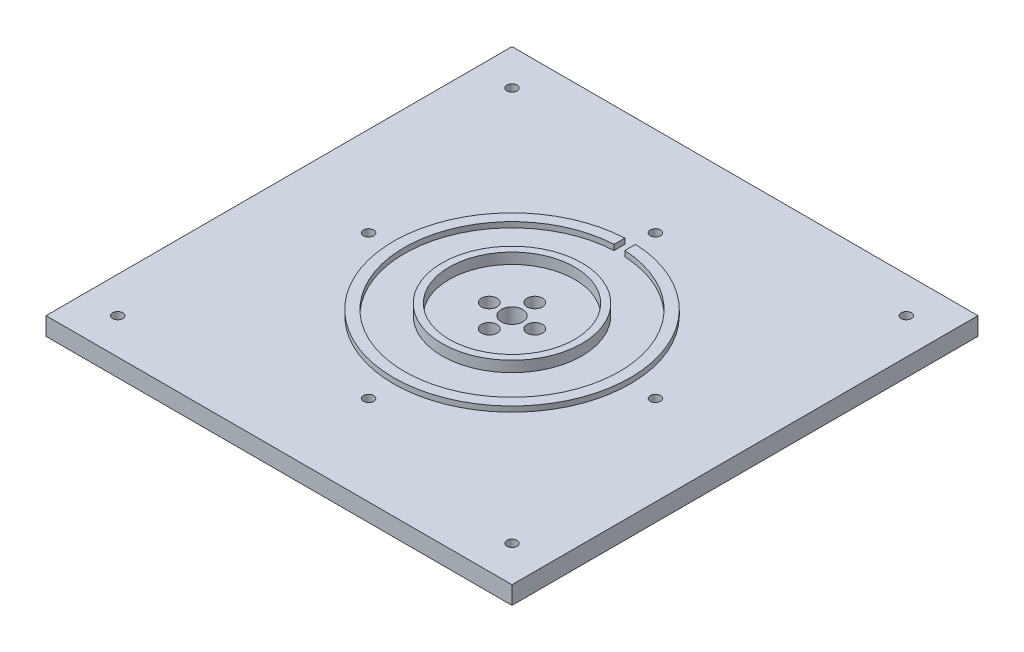
ISO-10303-21;
HEADER;
FILE_DESCRIPTION(('STEP AP214'),'2;1');
FILE_NAME('part.step','',(''),(''),'','','');
FILE_SCHEMA(('AUTOMOTIVE_DESIGN { 1 0 10303 214 1 1 1 1 }'));
ENDSEC;
DATA;
#1=APPLICATION_CONTEXT('core data for automotive mechanical design processes');
#2=APPLICATION_PROTOCOL_DEFINITION('international standard','automotive_design',2000,#1);
#3=PRODUCT_CONTEXT('',#1,'mechanical');
#4=PRODUCT('Part','Part','',(#3));
#5=PRODUCT_RELATED_PRODUCT_CATEGORY('part','',(#4));
#6=PRODUCT_DEFINITION_FORMATION('','',#4);
#7=PRODUCT_DEFINITION_CONTEXT('part definition',#1,'design');
#8=PRODUCT_DEFINITION('design','',#6,#7);
#9=PRODUCT_DEFINITION_SHAPE('','',#8);
#10=(LENGTH_UNIT() NAMED_UNIT(*) SI_UNIT(.MILLI.,.METRE.));
#11=(NAMED_UNIT(*) PLANE_ANGLE_UNIT() SI_UNIT($,.RADIAN.));
#12=(NAMED_UNIT(*) SI_UNIT($,.STERADIAN.) SOLID_ANGLE_UNIT());
#13=UNCERTAINTY_MEASURE_WITH_UNIT(LENGTH_MEASURE(1.E-05),#10,'distance_accuracy_value','');
#14=(GEOMETRIC_REPRESENTATION_CONTEXT(3) GLOBAL_UNCERTAINTY_ASSIGNED_CONTEXT((#13)) GLOBAL_UNIT_ASSIGNED_CONTEXT((#10,
#11,#12)) REPRESENTATION_CONTEXT('',''));
#15=CARTESIAN_POINT('',(0.,0.,0.));
#16=DIRECTION('',(0.,0.,1.));
#17=DIRECTION('',(1.,0.,0.));
#18=AXIS2_PLACEMENT_3D('',#15,#16,#17);
#19=CARTESIAN_POINT('',(0.,5.,0.));
#20=DIRECTION('',(0.,1.,0.));
#21=DIRECTION('',(0.,0.,1.));
#22=AXIS2_PLACEMENT_3D('',#19,#20,#21);
#23=PLANE('',#22);
#24=CARTESIAN_POINT('',(0.,5.,-6.35));
#25=DIRECTION('',(0.,1.,0.));
#26=DIRECTION('',(0.,0.,1.));
#27=AXIS2_PLACEMENT_3D('',#24,#25,#26);
#28=CIRCLE('',#27,2.15);
#29=CARTESIAN_POINT('',(0.,5.,-4.2));
#30=VERTEX_POINT('',#29);
#31=EDGE_CURVE('E216',#30,#30,#28,.T.);
#32=ORIENTED_EDGE('',*,*,#31,.F.);
#33=EDGE_LOOP('',(#32));
#34=FACE_BOUND('',#33,.T.);
#35=CARTESIAN_POINT('',(6.35000000000018,5.,-1.79700204165607E-13));
#36=DIRECTION('',(0.,1.,0.));
#37=DIRECTION('',(0.,0.,1.));
#38=AXIS2_PLACEMENT_3D('',#35,#36,#37);
#39=CIRCLE('',#38,2.15);
#40=CARTESIAN_POINT('',(6.35000000000018,5.,2.14999999999982));
#41=VERTEX_POINT('',#40);
#42=EDGE_CURVE('E217',#41,#41,#39,.T.);
#43=ORIENTED_EDGE('',*,*,#42,.F.);
#44=EDGE_LOOP('',(#43));
#45=FACE_BOUND('',#44,.T.);
#46=CARTESIAN_POINT('',(3.59400408331214E-13,5.,6.35));
#47=DIRECTION('',(0.,1.,0.));
#48=DIRECTION('',(0.,0.,1.));
#49=AXIS2_PLACEMENT_3D('',#46,#47,#48);
#50=CIRCLE('',#49,2.15);
#51=CARTESIAN_POINT('',(3.59400408331214E-13,5.,8.5));
#52=VERTEX_POINT('',#51);
#53=EDGE_CURVE('E204',#52,#52,#50,.T.);
#54=ORIENTED_EDGE('',*,*,#53,.F.);
#55=EDGE_LOOP('',(#54));
#56=FACE_BOUND('',#55,.T.);
#57=CARTESIAN_POINT('',(-6.34999999999982,5.,1.80477854883065E-13));
#58=DIRECTION('',(0.,1.,0.));
#59=DIRECTION('',(0.,0.,1.));
#60=AXIS2_PLACEMENT_3D('',#57,#58,#59);
#61=CIRCLE('',#60,2.15);
#62=CARTESIAN_POINT('',(-6.34999999999982,5.,2.15000000000018));
#63=VERTEX_POINT('',#62);
#64=EDGE_CURVE('E205',#63,#63,#61,.T.);
#65=ORIENTED_EDGE('',*,*,#64,.F.);
#66=EDGE_LOOP('',(#65));
#67=FACE_BOUND('',#66,.T.);
#68=CARTESIAN_POINT('',(0.,5.,0.));
#69=DIRECTION('',(0.,1.,0.));
#70=DIRECTION('',(0.,0.,1.));
#71=AXIS2_PLACEMENT_3D('',#68,#69,#70);
#72=CIRCLE('',#71,3.);
#73=CARTESIAN_POINT('',(0.,5.,3.));
#74=VERTEX_POINT('',#73);
#75=EDGE_CURVE('E169',#74,#74,#72,.T.);
#76=ORIENTED_EDGE('',*,*,#75,.F.);
#77=EDGE_LOOP('',(#76));
#78=FACE_BOUND('',#77,.T.);
#79=CARTESIAN_POINT('',(0.,5.,0.));
#80=DIRECTION('',(0.,1.,0.));
#81=DIRECTION('',(0.,0.,1.));
#82=AXIS2_PLACEMENT_3D('',#79,#80,#81);
#83=CIRCLE('',#82,17.5);
#84=CARTESIAN_POINT('',(0.,5.,17.5));
#85=VERTEX_POINT('',#84);
#86=EDGE_CURVE('E11',#85,#85,#83,.F.);
#87=ORIENTED_EDGE('',*,*,#86,.F.);
#88=EDGE_LOOP('',(#87));
#89=FACE_BOUND('',#88,.T.);
#90=ADVANCED_FACE('F36',(#34,#45,#56,#67,#78,#89),#23,.T.);
#91=CARTESIAN_POINT('',(0.,5.,65.));
#92=DIRECTION('',(0.,0.,-1.));
#93=DIRECTION('',(-1.,0.,0.));
#94=AXIS2_PLACEMENT_3D('',#91,#92,#93);
#95=PLANE('',#94);
#96=DIRECTION('',(1.,0.,0.));
#97=VECTOR('',#96,1.);
#98=CARTESIAN_POINT('',(0.,0.,65.));
#99=LINE('',#98,#97);
#100=CARTESIAN_POINT('',(-65.,0.,65.));
#101=VERTEX_POINT('',#100);
#102=CARTESIAN_POINT('',(65.,0.,65.));
#103=VERTEX_POINT('',#102);
#104=EDGE_CURVE('E134',#101,#103,#99,.T.);
#105=ORIENTED_EDGE('',*,*,#104,.T.);
#106=DIRECTION('',(0.,-1.,0.));
#107=VECTOR('',#106,1.);
#108=CARTESIAN_POINT('',(65.,5.,65.));
#109=LINE('',#108,#107);
#110=CARTESIAN_POINT('',(65.,5.,65.));
#111=VERTEX_POINT('',#110);
#112=EDGE_CURVE('E163',#111,#103,#109,.T.);
#113=ORIENTED_EDGE('',*,*,#112,.F.);
#114=DIRECTION('',(1.,0.,0.));
#115=VECTOR('',#114,1.);
#116=CARTESIAN_POINT('',(0.,5.,65.));
#117=LINE('',#116,#115);
#118=CARTESIAN_POINT('',(-65.,5.,65.));
#119=VERTEX_POINT('',#118);
#120=EDGE_CURVE('E140',#119,#111,#117,.T.);
#121=ORIENTED_EDGE('',*,*,#120,.F.);
#122=DIRECTION('',(0.,-1.,0.));
#123=VECTOR('',#122,1.);
#124=CARTESIAN_POINT('',(-65.,5.,65.));
#125=LINE('',#124,#123);
#126=EDGE_CURVE('E60',#119,#101,#125,.T.);
#127=ORIENTED_EDGE('',*,*,#126,.T.);
#128=EDGE_LOOP('',(#105,#113,#121,#127));
#129=FACE_BOUND('',#128,.T.);
#130=ADVANCED_FACE('F38',(#129),#95,.F.);
#131=CARTESIAN_POINT('',(65.,5.,0.));
#132=DIRECTION('',(-1.,0.,0.));
#133=DIRECTION('',(0.,0.,1.));
#134=AXIS2_PLACEMENT_3D('',#131,#132,#133);
#135=PLANE('',#134);
#136=DIRECTION('',(0.,0.,-1.));
#137=VECTOR('',#136,1.);
#138=CARTESIAN_POINT('',(65.,0.,0.));
#139=LINE('',#138,#137);
#140=CARTESIAN_POINT('',(65.,0.,-65.));
#141=VERTEX_POINT('',#140);
#142=EDGE_CURVE('E150',#103,#141,#139,.T.);
#143=ORIENTED_EDGE('',*,*,#142,.T.);
#144=DIRECTION('',(0.,-1.,0.));
#145=VECTOR('',#144,1.);
#146=CARTESIAN_POINT('',(65.,5.,-65.));
#147=LINE('',#146,#145);
#148=CARTESIAN_POINT('',(65.,5.,-65.));
#149=VERTEX_POINT('',#148);
#150=EDGE_CURVE('E161',#149,#141,#147,.T.);
#151=ORIENTED_EDGE('',*,*,#150,.F.);
#152=DIRECTION('',(0.,0.,-1.));
#153=VECTOR('',#152,1.);
#154=CARTESIAN_POINT('',(65.,5.,0.));
#155=LINE('',#154,#153);
#156=EDGE_CURVE('E87',#111,#149,#155,.T.);
#157=ORIENTED_EDGE('',*,*,#156,.F.);
#158=ORIENTED_EDGE('',*,*,#112,.T.);
#159=EDGE_LOOP('',(#143,#151,#157,#158));
#160=FACE_BOUND('',#159,.T.);
#161=ADVANCED_FACE('F335',(#160),#135,.F.);
#162=CARTESIAN_POINT('',(0.,5.,-65.));
#163=DIRECTION('',(0.,0.,-1.));
#164=DIRECTION('',(-1.,0.,0.));
#165=AXIS2_PLACEMENT_3D('',#162,#163,#164);
#166=PLANE('',#165);
#167=DIRECTION('',(1.,0.,0.));
#168=VECTOR('',#167,1.);
#169=CARTESIAN_POINT('',(0.,0.,-65.));
#170=LINE('',#169,#168);
#171=CARTESIAN_POINT('',(-65.,0.,-65.));
#172=VERTEX_POINT('',#171);
#173=EDGE_CURVE('E153',#172,#141,#170,.T.);
#174=ORIENTED_EDGE('',*,*,#173,.F.);
#175=DIRECTION('',(0.,-1.,0.));
#176=VECTOR('',#175,1.);
#177=CARTESIAN_POINT('',(-65.,5.,-65.));
#178=LINE('',#177,#176);
#179=CARTESIAN_POINT('',(-65.,5.,-65.));
#180=VERTEX_POINT('',#179);
#181=EDGE_CURVE('E159',#180,#172,#178,.T.);
#182=ORIENTED_EDGE('',*,*,#181,.F.);
#183=DIRECTION('',(1.,0.,0.));
#184=VECTOR('',#183,1.);
#185=CARTESIAN_POINT('',(0.,5.,-65.));
#186=LINE('',#185,#184);
#187=EDGE_CURVE('E144',#180,#149,#186,.T.);
#188=ORIENTED_EDGE('',*,*,#187,.T.);
#189=ORIENTED_EDGE('',*,*,#150,.T.);
#190=EDGE_LOOP('',(#174,#182,#188,#189));
#191=FACE_BOUND('',#190,.T.);
#192=ADVANCED_FACE('F333',(#191),#166,.T.);
#193=CARTESIAN_POINT('',(-65.,5.,0.));
#194=DIRECTION('',(-1.,0.,0.));
#195=DIRECTION('',(0.,0.,1.));
#196=AXIS2_PLACEMENT_3D('',#193,#194,#195);
#197=PLANE('',#196);
#198=DIRECTION('',(0.,0.,-1.));
#199=VECTOR('',#198,1.);
#200=CARTESIAN_POINT('',(-65.,0.,0.));
#201=LINE('',#200,#199);
#202=EDGE_CURVE('E142',#101,#172,#201,.T.);
#203=ORIENTED_EDGE('',*,*,#202,.F.);
#204=ORIENTED_EDGE('',*,*,#126,.F.);
#205=DIRECTION('',(0.,0.,-1.));
#206=VECTOR('',#205,1.);
#207=CARTESIAN_POINT('',(-65.,5.,0.));
#208=LINE('',#207,#206);
#209=EDGE_CURVE('E147',#119,#180,#208,.T.);
#210=ORIENTED_EDGE('',*,*,#209,.T.);
#211=ORIENTED_EDGE('',*,*,#181,.T.);
#212=EDGE_LOOP('',(#203,#204,#210,#211));
#213=FACE_BOUND('',#212,.T.);
#214=ADVANCED_FACE('F328',(#213),#197,.T.);
#215=CARTESIAN_POINT('',(0.,5.,0.));
#216=DIRECTION('',(0.,1.,0.));
#217=DIRECTION('',(0.,0.,1.));
#218=AXIS2_PLACEMENT_3D('',#215,#216,#217);
#219=CIRCLE('',#218,33.);
#220=CARTESIAN_POINT('',(-1.5,5.,-32.9658914637539));
#221=VERTEX_POINT('',#220);
#222=CARTESIAN_POINT('',(1.5,5.,-32.9658914637539));
#223=VERTEX_POINT('',#222);
#224=EDGE_CURVE('E124',#221,#223,#219,.T.);
#225=ORIENTED_EDGE('',*,*,#224,.F.);
#226=DIRECTION('',(0.,0.,-1.));
#227=VECTOR('',#226,1.);
#228=CARTESIAN_POINT('',(-1.5,5.,-27.4954595720909));
#229=LINE('',#228,#227);
#230=CARTESIAN_POINT('',(-1.5,5.,-29.9624765331573));
#231=VERTEX_POINT('',#230);
#232=EDGE_CURVE('E51',#231,#221,#229,.T.);
#233=ORIENTED_EDGE('',*,*,#232,.F.);
#234=CARTESIAN_POINT('',(0.,5.,0.));
#235=DIRECTION('',(0.,1.,0.));
#236=DIRECTION('',(0.,0.,1.));
#237=AXIS2_PLACEMENT_3D('',#234,#235,#236);
#238=CIRCLE('',#237,30.);
#239=CARTESIAN_POINT('',(1.5,5.,-29.9624765331573));
#240=VERTEX_POINT('',#239);
#241=EDGE_CURVE('E44',#240,#231,#238,.F.);
#242=ORIENTED_EDGE('',*,*,#241,.F.);
#243=DIRECTION('',(0.,0.,1.));
#244=VECTOR('',#243,1.);
#245=CARTESIAN_POINT('',(1.5,5.,-27.4954595720909));
#246=LINE('',#245,#244);
#247=EDGE_CURVE('E116',#223,#240,#246,.T.);
#248=ORIENTED_EDGE('',*,*,#247,.F.);
#249=EDGE_LOOP('',(#225,#233,#242,#248));
#250=FACE_BOUND('',#249,.T.);
#251=CARTESIAN_POINT('',(-40.,5.,0.));
#252=DIRECTION('',(0.,1.,0.));
#253=DIRECTION('',(0.,0.,1.));
#254=AXIS2_PLACEMENT_3D('',#251,#252,#253);
#255=CIRCLE('',#254,1.42);
#256=CARTESIAN_POINT('',(-40.,5.,1.42));
#257=VERTEX_POINT('',#256);
#258=EDGE_CURVE('E367',#257,#257,#255,.T.);
#259=ORIENTED_EDGE('',*,*,#258,.F.);
#260=EDGE_LOOP('',(#259));
#261=FACE_BOUND('',#260,.T.);
#262=CARTESIAN_POINT('',(1.39659253553725E-13,5.,-40.));
#263=DIRECTION('',(0.,1.,0.));
#264=DIRECTION('',(0.,0.,1.));
#265=AXIS2_PLACEMENT_3D('',#262,#263,#264);
#266=CIRCLE('',#265,1.41999999999999);
#267=CARTESIAN_POINT('',(1.39659253553725E-13,5.,-38.58));
#268=VERTEX_POINT('',#267);
#269=EDGE_CURVE('E364',#268,#268,#266,.T.);
#270=ORIENTED_EDGE('',*,*,#269,.F.);
#271=EDGE_LOOP('',(#270));
#272=FACE_BOUND('',#271,.T.);
#273=CARTESIAN_POINT('',(40.,5.,2.79318507107451E-13));
#274=DIRECTION('',(0.,1.,0.));
#275=DIRECTION('',(0.,0.,1.));
#276=AXIS2_PLACEMENT_3D('',#273,#274,#275);
#277=CIRCLE('',#276,1.41999999999999);
#278=CARTESIAN_POINT('',(40.,5.,1.42000000000027));
#279=VERTEX_POINT('',#278);
#280=EDGE_CURVE('E361',#279,#279,#277,.T.);
#281=ORIENTED_EDGE('',*,*,#280,.F.);
#282=EDGE_LOOP('',(#281));
#283=FACE_BOUND('',#282,.T.);
#284=CARTESIAN_POINT('',(-4.18977760661176E-13,5.,40.));
#285=DIRECTION('',(0.,1.,0.));
#286=DIRECTION('',(0.,0.,1.));
#287=AXIS2_PLACEMENT_3D('',#284,#285,#286);
#288=CIRCLE('',#287,1.42);
#289=CARTESIAN_POINT('',(-4.18977760661176E-13,5.,41.42));
#290=VERTEX_POINT('',#289);
#291=EDGE_CURVE('E356',#290,#290,#288,.T.);
#292=ORIENTED_EDGE('',*,*,#291,.F.);
#293=EDGE_LOOP('',(#292));
#294=FACE_BOUND('',#293,.T.);
#295=CARTESIAN_POINT('',(55.,5.,-55.));
#296=DIRECTION('',(0.,1.,0.));
#297=DIRECTION('',(0.,0.,-1.));
#298=AXIS2_PLACEMENT_3D('',#295,#296,#297);
#299=CIRCLE('',#298,1.42);
#300=CARTESIAN_POINT('',(55.,5.,-56.42));
#301=VERTEX_POINT('',#300);
#302=EDGE_CURVE('E199',#301,#301,#299,.T.);
#303=ORIENTED_EDGE('',*,*,#302,.F.);
#304=EDGE_LOOP('',(#303));
#305=FACE_BOUND('',#304,.T.);
#306=CARTESIAN_POINT('',(55.,5.,55.));
#307=DIRECTION('',(0.,1.,0.));
#308=DIRECTION('',(0.,0.,1.));
#309=AXIS2_PLACEMENT_3D('',#306,#307,#308);
#310=CIRCLE('',#309,1.42);
#311=CARTESIAN_POINT('',(55.,5.,56.42));
#312=VERTEX_POINT('',#311);
#313=EDGE_CURVE('E373',#312,#312,#310,.T.);
#314=ORIENTED_EDGE('',*,*,#313,.F.);
#315=EDGE_LOOP('',(#314));
#316=FACE_BOUND('',#315,.T.);
#317=CARTESIAN_POINT('',(-55.,5.,55.));
#318=DIRECTION('',(0.,1.,0.));
#319=DIRECTION('',(0.,0.,-1.));
#320=AXIS2_PLACEMENT_3D('',#317,#318,#319);
#321=CIRCLE('',#320,1.42);
#322=CARTESIAN_POINT('',(-55.,5.,53.58));
#323=VERTEX_POINT('',#322);
#324=EDGE_CURVE('E175',#323,#323,#321,.T.);
#325=ORIENTED_EDGE('',*,*,#324,.F.);
#326=EDGE_LOOP('',(#325));
#327=FACE_BOUND('',#326,.T.);
#328=CARTESIAN_POINT('',(-55.,5.,-55.));
#329=DIRECTION('',(0.,1.,0.));
#330=DIRECTION('',(0.,0.,1.));
#331=AXIS2_PLACEMENT_3D('',#328,#329,#330);
#332=CIRCLE('',#331,1.42);
#333=CARTESIAN_POINT('',(-55.,5.,-53.58));
#334=VERTEX_POINT('',#333);
#335=EDGE_CURVE('E170',#334,#334,#332,.T.);
#336=ORIENTED_EDGE('',*,*,#335,.F.);
#337=EDGE_LOOP('',(#336));
#338=FACE_BOUND('',#337,.T.);
#339=ORIENTED_EDGE('',*,*,#120,.T.);
#340=ORIENTED_EDGE('',*,*,#156,.T.);
#341=ORIENTED_EDGE('',*,*,#187,.F.);
#342=ORIENTED_EDGE('',*,*,#209,.F.);
#343=EDGE_LOOP('',(#339,#340,#341,#342));
#344=FACE_BOUND('',#343,.T.);
#345=CARTESIAN_POINT('',(0.,5.,0.));
#346=DIRECTION('',(0.,1.,0.));
#347=DIRECTION('',(0.,0.,1.));
#348=AXIS2_PLACEMENT_3D('',#345,#346,#347);
#349=CIRCLE('',#348,19.5);
#350=CARTESIAN_POINT('',(0.,5.,19.5));
#351=VERTEX_POINT('',#350);
#352=EDGE_CURVE('E350',#351,#351,#349,.T.);
#353=ORIENTED_EDGE('',*,*,#352,.F.);
#354=EDGE_LOOP('',(#353));
#355=FACE_BOUND('',#354,.T.);
#356=ADVANCED_FACE('F130',(#250,#261,#272,#283,#294,#305,#316,#327,#338,#344,#355),#23,.T.);
#357=CARTESIAN_POINT('',(0.,0.,0.));
#358=DIRECTION('',(0.,1.,0.));
#359=DIRECTION('',(0.,0.,1.));
#360=AXIS2_PLACEMENT_3D('',#357,#358,#359);
#361=PLANE('',#360);
#362=CARTESIAN_POINT('',(-40.,0.,0.));
#363=DIRECTION('',(0.,1.,0.));
#364=DIRECTION('',(0.,0.,1.));
#365=AXIS2_PLACEMENT_3D('',#362,#363,#364);
#366=CIRCLE('',#365,1.42);
#367=CARTESIAN_POINT('',(-40.,0.,1.42));
#368=VERTEX_POINT('',#367);
#369=EDGE_CURVE('E189',#368,#368,#366,.T.);
#370=ORIENTED_EDGE('',*,*,#369,.T.);
#371=EDGE_LOOP('',(#370));
#372=FACE_BOUND('',#371,.T.);
#373=CARTESIAN_POINT('',(1.39659253553725E-13,0.,-40.));
#374=DIRECTION('',(0.,1.,0.));
#375=DIRECTION('',(0.,0.,1.));
#376=AXIS2_PLACEMENT_3D('',#373,#374,#375);
#377=CIRCLE('',#376,1.41999999999999);
#378=CARTESIAN_POINT('',(1.39659253553725E-13,0.,-38.58));
#379=VERTEX_POINT('',#378);
#380=EDGE_CURVE('E187',#379,#379,#377,.T.);
#381=ORIENTED_EDGE('',*,*,#380,.T.);
#382=EDGE_LOOP('',(#381));
#383=FACE_BOUND('',#382,.T.);
#384=CARTESIAN_POINT('',(40.,0.,2.79318507107451E-13));
#385=DIRECTION('',(0.,1.,0.));
#386=DIRECTION('',(0.,0.,1.));
#387=AXIS2_PLACEMENT_3D('',#384,#385,#386);
#388=CIRCLE('',#387,1.41999999999999);
#389=CARTESIAN_POINT('',(40.,0.,1.42000000000027));
#390=VERTEX_POINT('',#389);
#391=EDGE_CURVE('E184',#390,#390,#388,.T.);
#392=ORIENTED_EDGE('',*,*,#391,.T.);
#393=EDGE_LOOP('',(#392));
#394=FACE_BOUND('',#393,.T.);
#395=CARTESIAN_POINT('',(-4.18977760661176E-13,0.,40.));
#396=DIRECTION('',(0.,1.,0.));
#397=DIRECTION('',(0.,0.,1.));
#398=AXIS2_PLACEMENT_3D('',#395,#396,#397);
#399=CIRCLE('',#398,1.42);
#400=CARTESIAN_POINT('',(-4.18977760661176E-13,0.,41.42));
#401=VERTEX_POINT('',#400);
#402=EDGE_CURVE('E181',#401,#401,#399,.T.);
#403=ORIENTED_EDGE('',*,*,#402,.T.);
#404=EDGE_LOOP('',(#403));
#405=FACE_BOUND('',#404,.T.);
#406=CARTESIAN_POINT('',(55.,0.,-55.));
#407=DIRECTION('',(0.,1.,0.));
#408=DIRECTION('',(0.,0.,1.));
#409=AXIS2_PLACEMENT_3D('',#406,#407,#408);
#410=CIRCLE('',#409,1.42);
#411=CARTESIAN_POINT('',(55.,0.,-53.58));
#412=VERTEX_POINT('',#411);
#413=EDGE_CURVE('E178',#412,#412,#410,.T.);
#414=ORIENTED_EDGE('',*,*,#413,.T.);
#415=EDGE_LOOP('',(#414));
#416=FACE_BOUND('',#415,.T.);
#417=CARTESIAN_POINT('',(55.,0.,55.));
#418=DIRECTION('',(0.,1.,0.));
#419=DIRECTION('',(0.,0.,1.));
#420=AXIS2_PLACEMENT_3D('',#417,#418,#419);
#421=CIRCLE('',#420,1.42);
#422=CARTESIAN_POINT('',(55.,0.,56.42));
#423=VERTEX_POINT('',#422);
#424=EDGE_CURVE('E174',#423,#423,#421,.T.);
#425=ORIENTED_EDGE('',*,*,#424,.T.);
#426=EDGE_LOOP('',(#425));
#427=FACE_BOUND('',#426,.T.);
#428=CARTESIAN_POINT('',(-55.,0.,55.));
#429=DIRECTION('',(0.,1.,0.));
#430=DIRECTION('',(0.,0.,1.));
#431=AXIS2_PLACEMENT_3D('',#428,#429,#430);
#432=CIRCLE('',#431,1.42);
#433=CARTESIAN_POINT('',(-55.,0.,56.42));
#434=VERTEX_POINT('',#433);
#435=EDGE_CURVE('E171',#434,#434,#432,.T.);
#436=ORIENTED_EDGE('',*,*,#435,.T.);
#437=EDGE_LOOP('',(#436));
#438=FACE_BOUND('',#437,.T.);
#439=CARTESIAN_POINT('',(-55.,0.,-55.));
#440=DIRECTION('',(0.,1.,0.));
#441=DIRECTION('',(0.,0.,1.));
#442=AXIS2_PLACEMENT_3D('',#439,#440,#441);
#443=CIRCLE('',#442,1.42);
#444=CARTESIAN_POINT('',(-55.,0.,-53.58));
#445=VERTEX_POINT('',#444);
#446=EDGE_CURVE('E166',#445,#445,#443,.T.);
#447=ORIENTED_EDGE('',*,*,#446,.T.);
#448=EDGE_LOOP('',(#447));
#449=FACE_BOUND('',#448,.T.);
#450=CARTESIAN_POINT('',(0.,0.,0.));
#451=DIRECTION('',(0.,1.,0.));
#452=DIRECTION('',(0.,0.,1.));
#453=AXIS2_PLACEMENT_3D('',#450,#451,#452);
#454=CIRCLE('',#453,3.);
#455=CARTESIAN_POINT('',(0.,0.,3.));
#456=VERTEX_POINT('',#455);
#457=EDGE_CURVE('E208',#456,#456,#454,.T.);
#458=ORIENTED_EDGE('',*,*,#457,.T.);
#459=EDGE_LOOP('',(#458));
#460=FACE_BOUND('',#459,.T.);
#461=CARTESIAN_POINT('',(-6.34999999999982,0.,1.80477854883065E-13));
#462=DIRECTION('',(0.,1.,0.));
#463=DIRECTION('',(0.,0.,1.));
#464=AXIS2_PLACEMENT_3D('',#461,#462,#463);
#465=CIRCLE('',#464,2.15);
#466=CARTESIAN_POINT('',(-6.34999999999982,0.,2.15000000000018));
#467=VERTEX_POINT('',#466);
#468=EDGE_CURVE('E201',#467,#467,#465,.T.);
#469=ORIENTED_EDGE('',*,*,#468,.T.);
#470=EDGE_LOOP('',(#469));
#471=FACE_BOUND('',#470,.T.);
#472=CARTESIAN_POINT('',(3.59400408331214E-13,0.,6.35));
#473=DIRECTION('',(0.,1.,0.));
#474=DIRECTION('',(0.,0.,1.));
#475=AXIS2_PLACEMENT_3D('',#472,#473,#474);
#476=CIRCLE('',#475,2.15);
#477=CARTESIAN_POINT('',(3.59400408331214E-13,0.,8.5));
#478=VERTEX_POINT('',#477);
#479=EDGE_CURVE('E220',#478,#478,#476,.T.);
#480=ORIENTED_EDGE('',*,*,#479,.T.);
#481=EDGE_LOOP('',(#480));
#482=FACE_BOUND('',#481,.T.);
#483=CARTESIAN_POINT('',(6.35000000000018,0.,-1.79700204165607E-13));
#484=DIRECTION('',(0.,1.,0.));
#485=DIRECTION('',(0.,0.,1.));
#486=AXIS2_PLACEMENT_3D('',#483,#484,#485);
#487=CIRCLE('',#486,2.15);
#488=CARTESIAN_POINT('',(6.35000000000018,0.,2.14999999999982));
#489=VERTEX_POINT('',#488);
#490=EDGE_CURVE('E213',#489,#489,#487,.T.);
#491=ORIENTED_EDGE('',*,*,#490,.T.);
#492=EDGE_LOOP('',(#491));
#493=FACE_BOUND('',#492,.T.);
#494=CARTESIAN_POINT('',(0.,0.,-6.35));
#495=DIRECTION('',(0.,1.,0.));
#496=DIRECTION('',(0.,0.,1.));
#497=AXIS2_PLACEMENT_3D('',#494,#495,#496);
#498=CIRCLE('',#497,2.15);
#499=CARTESIAN_POINT('',(0.,0.,-4.2));
#500=VERTEX_POINT('',#499);
#501=EDGE_CURVE('E137',#500,#500,#498,.T.);
#502=ORIENTED_EDGE('',*,*,#501,.T.);
#503=EDGE_LOOP('',(#502));
#504=FACE_BOUND('',#503,.T.);
#505=ORIENTED_EDGE('',*,*,#104,.F.);
#506=ORIENTED_EDGE('',*,*,#202,.T.);
#507=ORIENTED_EDGE('',*,*,#173,.T.);
#508=ORIENTED_EDGE('',*,*,#142,.F.);
#509=EDGE_LOOP('',(#505,#506,#507,#508));
#510=FACE_BOUND('',#509,.T.);
#511=ADVANCED_FACE('F323',(#372,#383,#394,#405,#416,#427,#438,#449,#460,#471,#482,#493,#504,
#510),#361,.F.);
#512=CARTESIAN_POINT('',(0.,6.5,0.));
#513=DIRECTION('',(0.,1.,0.));
#514=DIRECTION('',(0.,0.,1.));
#515=AXIS2_PLACEMENT_3D('',#512,#513,#514);
#516=PLANE('',#515);
#517=DIRECTION('',(0.,0.,-1.));
#518=VECTOR('',#517,1.);
#519=CARTESIAN_POINT('',(1.5,6.5,-27.4954595720909));
#520=LINE('',#519,#518);
#521=CARTESIAN_POINT('',(1.5,6.5,-29.9624765331573));
#522=VERTEX_POINT('',#521);
#523=CARTESIAN_POINT('',(1.5,6.5,-32.9658914637539));
#524=VERTEX_POINT('',#523);
#525=EDGE_CURVE('E431',#522,#524,#520,.T.);
#526=ORIENTED_EDGE('',*,*,#525,.F.);
#527=CARTESIAN_POINT('',(0.,6.5,0.));
#528=DIRECTION('',(0.,1.,0.));
#529=DIRECTION('',(0.,0.,1.));
#530=AXIS2_PLACEMENT_3D('',#527,#528,#529);
#531=CIRCLE('',#530,30.);
#532=CARTESIAN_POINT('',(-1.5,6.5,-29.9624765331573));
#533=VERTEX_POINT('',#532);
#534=EDGE_CURVE('E132',#533,#522,#531,.T.);
#535=ORIENTED_EDGE('',*,*,#534,.F.);
#536=DIRECTION('',(0.,0.,1.));
#537=VECTOR('',#536,1.);
#538=CARTESIAN_POINT('',(-1.5,6.5,-27.4954595720909));
#539=LINE('',#538,#537);
#540=CARTESIAN_POINT('',(-1.5,6.5,-32.9658914637539));
#541=VERTEX_POINT('',#540);
#542=EDGE_CURVE('E117',#541,#533,#539,.T.);
#543=ORIENTED_EDGE('',*,*,#542,.F.);
#544=CARTESIAN_POINT('',(0.,6.5,0.));
#545=DIRECTION('',(0.,1.,0.));
#546=DIRECTION('',(0.,0.,1.));
#547=AXIS2_PLACEMENT_3D('',#544,#545,#546);
#548=CIRCLE('',#547,33.);
#549=EDGE_CURVE('E126',#541,#524,#548,.T.);
#550=ORIENTED_EDGE('',*,*,#549,.T.);
#551=EDGE_LOOP('',(#526,#535,#543,#550));
#552=FACE_BOUND('',#551,.T.);
#553=ADVANCED_FACE('F320',(#552),#516,.T.);
#554=CARTESIAN_POINT('',(0.,6.5,0.));
#555=DIRECTION('',(0.,-1.,0.));
#556=DIRECTION('',(0.,0.,-1.));
#557=AXIS2_PLACEMENT_3D('',#554,#555,#556);
#558=CYLINDRICAL_SURFACE('',#557,33.);
#559=ORIENTED_EDGE('',*,*,#224,.T.);
#560=DIRECTION('',(0.,-1.,0.));
#561=VECTOR('',#560,1.);
#562=CARTESIAN_POINT('',(1.5,6.5,-32.9658914637539));
#563=LINE('',#562,#561);
#564=EDGE_CURVE('E358',#223,#524,#563,.F.);
#565=ORIENTED_EDGE('',*,*,#564,.T.);
#566=ORIENTED_EDGE('',*,*,#549,.F.);
#567=DIRECTION('',(0.,-1.,0.));
#568=VECTOR('',#567,1.);
#569=CARTESIAN_POINT('',(-1.5,6.5,-32.9658914637539));
#570=LINE('',#569,#568);
#571=EDGE_CURVE('E111',#541,#221,#570,.T.);
#572=ORIENTED_EDGE('',*,*,#571,.T.);
#573=EDGE_LOOP('',(#559,#565,#566,#572));
#574=FACE_BOUND('',#573,.T.);
#575=ADVANCED_FACE('F122',(#574),#558,.T.);
#576=CARTESIAN_POINT('',(0.,6.5,0.));
#577=DIRECTION('',(0.,-1.,0.));
#578=DIRECTION('',(0.,0.,-1.));
#579=AXIS2_PLACEMENT_3D('',#576,#577,#578);
#580=CYLINDRICAL_SURFACE('',#579,30.);
#581=DIRECTION('',(0.,-1.,0.));
#582=VECTOR('',#581,1.);
#583=CARTESIAN_POINT('',(1.5,6.5,-29.9624765331573));
#584=LINE('',#583,#582);
#585=EDGE_CURVE('E127',#240,#522,#584,.F.);
#586=ORIENTED_EDGE('',*,*,#585,.F.);
#587=ORIENTED_EDGE('',*,*,#241,.T.);
#588=DIRECTION('',(0.,-1.,0.));
#589=VECTOR('',#588,1.);
#590=CARTESIAN_POINT('',(-1.5,6.5,-29.9624765331573));
#591=LINE('',#590,#589);
#592=EDGE_CURVE('E114',#533,#231,#591,.T.);
#593=ORIENTED_EDGE('',*,*,#592,.F.);
#594=ORIENTED_EDGE('',*,*,#534,.T.);
#595=EDGE_LOOP('',(#586,#587,#593,#594));
#596=FACE_BOUND('',#595,.T.);
#597=ADVANCED_FACE('F315',(#596),#580,.F.);
#598=CARTESIAN_POINT('',(0.,0.,-6.35));
#599=DIRECTION('',(0.,1.,0.));
#600=DIRECTION('',(0.,0.,1.));
#601=AXIS2_PLACEMENT_3D('',#598,#599,#600);
#602=CYLINDRICAL_SURFACE('',#601,2.15);
#603=ORIENTED_EDGE('',*,*,#501,.F.);
#604=EDGE_LOOP('',(#603));
#605=FACE_BOUND('',#604,.T.);
#606=ORIENTED_EDGE('',*,*,#31,.T.);
#607=EDGE_LOOP('',(#606));
#608=FACE_BOUND('',#607,.T.);
#609=ADVANCED_FACE('F230',(#605,#608),#602,.F.);
#610=CARTESIAN_POINT('',(6.35000000000018,0.,-1.79700204165607E-13));
#611=DIRECTION('',(0.,1.,0.));
#612=DIRECTION('',(0.,0.,1.));
#613=AXIS2_PLACEMENT_3D('',#610,#611,#612);
#614=CYLINDRICAL_SURFACE('',#613,2.15);
#615=ORIENTED_EDGE('',*,*,#490,.F.);
#616=EDGE_LOOP('',(#615));
#617=FACE_BOUND('',#616,.T.);
#618=ORIENTED_EDGE('',*,*,#42,.T.);
#619=EDGE_LOOP('',(#618));
#620=FACE_BOUND('',#619,.T.);
#621=ADVANCED_FACE('F306',(#617,#620),#614,.F.);
#622=CARTESIAN_POINT('',(3.59400408331214E-13,0.,6.35));
#623=DIRECTION('',(0.,1.,0.));
#624=DIRECTION('',(0.,0.,1.));
#625=AXIS2_PLACEMENT_3D('',#622,#623,#624);
#626=CYLINDRICAL_SURFACE('',#625,2.15);
#627=ORIENTED_EDGE('',*,*,#479,.F.);
#628=EDGE_LOOP('',(#627));
#629=FACE_BOUND('',#628,.T.);
#630=ORIENTED_EDGE('',*,*,#53,.T.);
#631=EDGE_LOOP('',(#630));
#632=FACE_BOUND('',#631,.T.);
#633=ADVANCED_FACE('F301',(#629,#632),#626,.F.);
#634=CARTESIAN_POINT('',(-6.34999999999982,0.,1.80477854883065E-13));
#635=DIRECTION('',(0.,1.,0.));
#636=DIRECTION('',(0.,0.,1.));
#637=AXIS2_PLACEMENT_3D('',#634,#635,#636);
#638=CYLINDRICAL_SURFACE('',#637,2.15);
#639=ORIENTED_EDGE('',*,*,#468,.F.);
#640=EDGE_LOOP('',(#639));
#641=FACE_BOUND('',#640,.T.);
#642=ORIENTED_EDGE('',*,*,#64,.T.);
#643=EDGE_LOOP('',(#642));
#644=FACE_BOUND('',#643,.T.);
#645=ADVANCED_FACE('F298',(#641,#644),#638,.F.);
#646=CARTESIAN_POINT('',(0.,0.,0.));
#647=DIRECTION('',(0.,1.,0.));
#648=DIRECTION('',(0.,0.,1.));
#649=AXIS2_PLACEMENT_3D('',#646,#647,#648);
#650=CYLINDRICAL_SURFACE('',#649,3.);
#651=ORIENTED_EDGE('',*,*,#457,.F.);
#652=EDGE_LOOP('',(#651));
#653=FACE_BOUND('',#652,.T.);
#654=ORIENTED_EDGE('',*,*,#75,.T.);
#655=EDGE_LOOP('',(#654));
#656=FACE_BOUND('',#655,.T.);
#657=ADVANCED_FACE('F297',(#653,#656),#650,.F.);
#658=CARTESIAN_POINT('',(-55.,-5.,-55.));
#659=DIRECTION('',(0.,1.,0.));
#660=DIRECTION('',(0.,0.,1.));
#661=AXIS2_PLACEMENT_3D('',#658,#659,#660);
#662=CYLINDRICAL_SURFACE('',#661,1.42);
#663=ORIENTED_EDGE('',*,*,#335,.T.);
#664=EDGE_LOOP('',(#663));
#665=FACE_BOUND('',#664,.T.);
#666=ORIENTED_EDGE('',*,*,#446,.F.);
#667=EDGE_LOOP('',(#666));
#668=FACE_BOUND('',#667,.T.);
#669=ADVANCED_FACE('F287',(#665,#668),#662,.F.);
#670=CARTESIAN_POINT('',(-55.,-5.,55.));
#671=DIRECTION('',(0.,1.,0.));
#672=DIRECTION('',(0.,0.,1.));
#673=AXIS2_PLACEMENT_3D('',#670,#671,#672);
#674=CYLINDRICAL_SURFACE('',#673,1.42);
#675=ORIENTED_EDGE('',*,*,#324,.T.);
#676=EDGE_LOOP('',(#675));
#677=FACE_BOUND('',#676,.T.);
#678=ORIENTED_EDGE('',*,*,#435,.F.);
#679=EDGE_LOOP('',(#678));
#680=FACE_BOUND('',#679,.T.);
#681=ADVANCED_FACE('F283',(#677,#680),#674,.F.);
#682=CARTESIAN_POINT('',(55.,-5.,55.));
#683=DIRECTION('',(0.,1.,0.));
#684=DIRECTION('',(0.,0.,1.));
#685=AXIS2_PLACEMENT_3D('',#682,#683,#684);
#686=CYLINDRICAL_SURFACE('',#685,1.42);
#687=ORIENTED_EDGE('',*,*,#313,.T.);
#688=EDGE_LOOP('',(#687));
#689=FACE_BOUND('',#688,.T.);
#690=ORIENTED_EDGE('',*,*,#424,.F.);
#691=EDGE_LOOP('',(#690));
#692=FACE_BOUND('',#691,.T.);
#693=ADVANCED_FACE('F286',(#689,#692),#686,.F.);
#694=CARTESIAN_POINT('',(55.,-5.,-55.));
#695=DIRECTION('',(0.,1.,0.));
#696=DIRECTION('',(0.,0.,1.));
#697=AXIS2_PLACEMENT_3D('',#694,#695,#696);
#698=CYLINDRICAL_SURFACE('',#697,1.42);
#699=ORIENTED_EDGE('',*,*,#302,.T.);
#700=EDGE_LOOP('',(#699));
#701=FACE_BOUND('',#700,.T.);
#702=ORIENTED_EDGE('',*,*,#413,.F.);
#703=EDGE_LOOP('',(#702));
#704=FACE_BOUND('',#703,.T.);
#705=ADVANCED_FACE('F275',(#701,#704),#698,.F.);
#706=CARTESIAN_POINT('',(-4.18977760661176E-13,-5.,40.));
#707=DIRECTION('',(0.,1.,0.));
#708=DIRECTION('',(0.,0.,1.));
#709=AXIS2_PLACEMENT_3D('',#706,#707,#708);
#710=CYLINDRICAL_SURFACE('',#709,1.42);
#711=ORIENTED_EDGE('',*,*,#291,.T.);
#712=EDGE_LOOP('',(#711));
#713=FACE_BOUND('',#712,.T.);
#714=ORIENTED_EDGE('',*,*,#402,.F.);
#715=EDGE_LOOP('',(#714));
#716=FACE_BOUND('',#715,.T.);
#717=ADVANCED_FACE('F271',(#713,#716),#710,.F.);
#718=CARTESIAN_POINT('',(40.,-5.,2.79318507107451E-13));
#719=DIRECTION('',(0.,1.,0.));
#720=DIRECTION('',(0.,0.,1.));
#721=AXIS2_PLACEMENT_3D('',#718,#719,#720);
#722=CYLINDRICAL_SURFACE('',#721,1.41999999999999);
#723=ORIENTED_EDGE('',*,*,#280,.T.);
#724=EDGE_LOOP('',(#723));
#725=FACE_BOUND('',#724,.T.);
#726=ORIENTED_EDGE('',*,*,#391,.F.);
#727=EDGE_LOOP('',(#726));
#728=FACE_BOUND('',#727,.T.);
#729=ADVANCED_FACE('F267',(#725,#728),#722,.F.);
#730=CARTESIAN_POINT('',(1.39659253553725E-13,-5.,-40.));
#731=DIRECTION('',(0.,1.,0.));
#732=DIRECTION('',(0.,0.,1.));
#733=AXIS2_PLACEMENT_3D('',#730,#731,#732);
#734=CYLINDRICAL_SURFACE('',#733,1.41999999999999);
#735=ORIENTED_EDGE('',*,*,#269,.T.);
#736=EDGE_LOOP('',(#735));
#737=FACE_BOUND('',#736,.T.);
#738=ORIENTED_EDGE('',*,*,#380,.F.);
#739=EDGE_LOOP('',(#738));
#740=FACE_BOUND('',#739,.T.);
#741=ADVANCED_FACE('F270',(#737,#740),#734,.F.);
#742=CARTESIAN_POINT('',(-40.,-5.,0.));
#743=DIRECTION('',(0.,1.,0.));
#744=DIRECTION('',(0.,0.,1.));
#745=AXIS2_PLACEMENT_3D('',#742,#743,#744);
#746=CYLINDRICAL_SURFACE('',#745,1.42);
#747=ORIENTED_EDGE('',*,*,#258,.T.);
#748=EDGE_LOOP('',(#747));
#749=FACE_BOUND('',#748,.T.);
#750=ORIENTED_EDGE('',*,*,#369,.F.);
#751=EDGE_LOOP('',(#750));
#752=FACE_BOUND('',#751,.T.);
#753=ADVANCED_FACE('F264',(#749,#752),#746,.F.);
#754=CARTESIAN_POINT('',(0.,8.,0.));
#755=DIRECTION('',(0.,1.,0.));
#756=DIRECTION('',(0.,0.,1.));
#757=AXIS2_PLACEMENT_3D('',#754,#755,#756);
#758=PLANE('',#757);
#759=CARTESIAN_POINT('',(0.,8.,0.));
#760=DIRECTION('',(0.,1.,0.));
#761=DIRECTION('',(0.,0.,1.));
#762=AXIS2_PLACEMENT_3D('',#759,#760,#761);
#763=CIRCLE('',#762,19.5);
#764=CARTESIAN_POINT('',(0.,8.,19.5));
#765=VERTEX_POINT('',#764);
#766=EDGE_CURVE('E352',#765,#765,#763,.T.);
#767=ORIENTED_EDGE('',*,*,#766,.T.);
#768=EDGE_LOOP('',(#767));
#769=FACE_BOUND('',#768,.T.);
#770=CARTESIAN_POINT('',(0.,8.,0.));
#771=DIRECTION('',(0.,1.,0.));
#772=DIRECTION('',(0.,0.,1.));
#773=AXIS2_PLACEMENT_3D('',#770,#771,#772);
#774=CIRCLE('',#773,17.5);
#775=CARTESIAN_POINT('',(0.,8.,17.5));
#776=VERTEX_POINT('',#775);
#777=EDGE_CURVE('E353',#776,#776,#774,.T.);
#778=ORIENTED_EDGE('',*,*,#777,.F.);
#779=EDGE_LOOP('',(#778));
#780=FACE_BOUND('',#779,.T.);
#781=ADVANCED_FACE('F257',(#769,#780),#758,.T.);
#782=CARTESIAN_POINT('',(0.,8.,0.));
#783=DIRECTION('',(0.,-1.,0.));
#784=DIRECTION('',(0.,0.,-1.));
#785=AXIS2_PLACEMENT_3D('',#782,#783,#784);
#786=CYLINDRICAL_SURFACE('',#785,19.5);
#787=ORIENTED_EDGE('',*,*,#766,.F.);
#788=EDGE_LOOP('',(#787));
#789=FACE_BOUND('',#788,.T.);
#790=ORIENTED_EDGE('',*,*,#352,.T.);
#791=EDGE_LOOP('',(#790));
#792=FACE_BOUND('',#791,.T.);
#793=ADVANCED_FACE('F248',(#789,#792),#786,.T.);
#794=CARTESIAN_POINT('',(0.,8.,0.));
#795=DIRECTION('',(0.,-1.,0.));
#796=DIRECTION('',(0.,0.,-1.));
#797=AXIS2_PLACEMENT_3D('',#794,#795,#796);
#798=CYLINDRICAL_SURFACE('',#797,17.5);
#799=ORIENTED_EDGE('',*,*,#777,.T.);
#800=EDGE_LOOP('',(#799));
#801=FACE_BOUND('',#800,.T.);
#802=ORIENTED_EDGE('',*,*,#86,.T.);
#803=EDGE_LOOP('',(#802));
#804=FACE_BOUND('',#803,.T.);
#805=ADVANCED_FACE('F245',(#801,#804),#798,.F.);
#806=CARTESIAN_POINT('',(1.5,-3.37552519119205,-27.4954595720909));
#807=DIRECTION('',(1.,0.,0.));
#808=DIRECTION('',(0.,0.,-1.));
#809=AXIS2_PLACEMENT_3D('',#806,#807,#808);
#810=PLANE('',#809);
#811=ORIENTED_EDGE('',*,*,#247,.T.);
#812=ORIENTED_EDGE('',*,*,#585,.T.);
#813=ORIENTED_EDGE('',*,*,#525,.T.);
#814=ORIENTED_EDGE('',*,*,#564,.F.);
#815=EDGE_LOOP('',(#811,#812,#813,#814));
#816=FACE_BOUND('',#815,.T.);
#817=ADVANCED_FACE('F247',(#816),#810,.F.);
#818=CARTESIAN_POINT('',(-1.5,-3.37552519119205,-27.4954595720909));
#819=DIRECTION('',(-1.,0.,0.));
#820=DIRECTION('',(0.,0.,1.));
#821=AXIS2_PLACEMENT_3D('',#818,#819,#820);
#822=PLANE('',#821);
#823=ORIENTED_EDGE('',*,*,#542,.T.);
#824=ORIENTED_EDGE('',*,*,#592,.T.);
#825=ORIENTED_EDGE('',*,*,#232,.T.);
#826=ORIENTED_EDGE('',*,*,#571,.F.);
#827=EDGE_LOOP('',(#823,#824,#825,#826));
#828=FACE_BOUND('',#827,.T.);
#829=ADVANCED_FACE('F110',(#828),#822,.F.);
#830=CLOSED_SHELL('',(#90,#130,#161,#192,#214,#356,#511,#553,#575,#597,#609,#621,#633,#645,#657,
#669,#681,#693,#705,#717,#729,#741,#753,#781,#793,#805,#817,#829));
#831=MANIFOLD_SOLID_BREP('B2',#830);
#832=ADVANCED_BREP_SHAPE_REPRESENTATION('',(#18,#831),#14);
#833=SHAPE_DEFINITION_REPRESENTATION(#9,#832);
ENDSEC;
END-ISO-10303-21;
